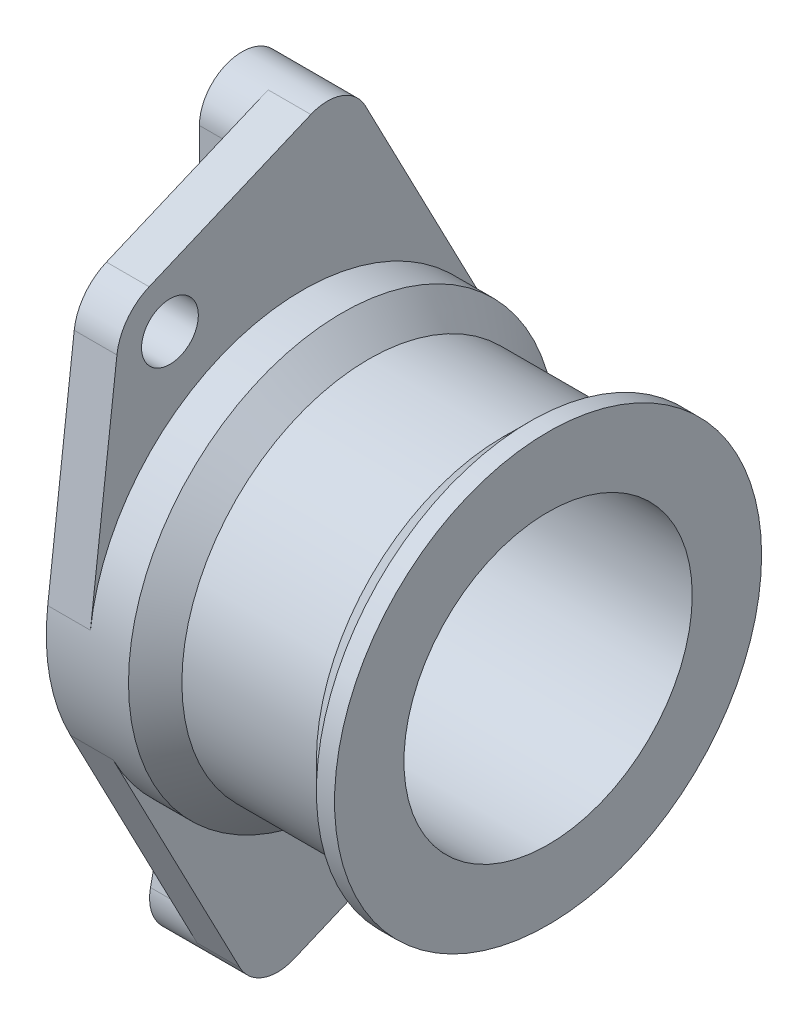
ISO-10303-21;
HEADER;
FILE_DESCRIPTION(('STEP AP214'),'2;1');
FILE_NAME('part.step','',(''),(''),'','','');
FILE_SCHEMA(('AUTOMOTIVE_DESIGN { 1 0 10303 214 1 1 1 1 }'));
ENDSEC;
DATA;
#1=APPLICATION_CONTEXT('core data for automotive mechanical design processes');
#2=APPLICATION_PROTOCOL_DEFINITION('international standard','automotive_design',2000,#1);
#3=PRODUCT_CONTEXT('',#1,'mechanical');
#4=PRODUCT('Part','Part','',(#3));
#5=PRODUCT_RELATED_PRODUCT_CATEGORY('part','',(#4));
#6=PRODUCT_DEFINITION_FORMATION('','',#4);
#7=PRODUCT_DEFINITION_CONTEXT('part definition',#1,'design');
#8=PRODUCT_DEFINITION('design','',#6,#7);
#9=PRODUCT_DEFINITION_SHAPE('','',#8);
#10=(LENGTH_UNIT() NAMED_UNIT(*) SI_UNIT(.MILLI.,.METRE.));
#11=(NAMED_UNIT(*) PLANE_ANGLE_UNIT() SI_UNIT($,.RADIAN.));
#12=(NAMED_UNIT(*) SI_UNIT($,.STERADIAN.) SOLID_ANGLE_UNIT());
#13=UNCERTAINTY_MEASURE_WITH_UNIT(LENGTH_MEASURE(1.E-05),#10,'distance_accuracy_value','');
#14=(GEOMETRIC_REPRESENTATION_CONTEXT(3) GLOBAL_UNCERTAINTY_ASSIGNED_CONTEXT((#13)) GLOBAL_UNIT_ASSIGNED_CONTEXT((#10,
#11,#12)) REPRESENTATION_CONTEXT('',''));
#15=CARTESIAN_POINT('',(0.,0.,0.));
#16=DIRECTION('',(0.,0.,1.));
#17=DIRECTION('',(1.,0.,0.));
#18=AXIS2_PLACEMENT_3D('',#15,#16,#17);
#19=CARTESIAN_POINT('',(0.,-38.3206980670754,2.96616859215302));
#20=DIRECTION('',(1.,0.,0.));
#21=DIRECTION('',(0.,0.,-1.));
#22=AXIS2_PLACEMENT_3D('',#19,#20,#21);
#23=PLANE('',#22);
#24=CARTESIAN_POINT('',(0.,0.,0.));
#25=DIRECTION('',(1.,0.,0.));
#26=DIRECTION('',(0.,0.,-1.));
#27=AXIS2_PLACEMENT_3D('',#24,#25,#26);
#28=CIRCLE('',#27,17.145);
#29=CARTESIAN_POINT('',(0.,0.,-17.145));
#30=VERTEX_POINT('',#29);
#31=EDGE_CURVE('E613',#30,#30,#28,.T.);
#32=ORIENTED_EDGE('',*,*,#31,.T.);
#33=EDGE_LOOP('',(#32));
#34=FACE_BOUND('',#33,.T.);
#35=CARTESIAN_POINT('',(0.,-29.0113860377605,-15.7689530460338));
#36=DIRECTION('',(-1.,0.,0.));
#37=DIRECTION('',(0.,0.,1.));
#38=AXIS2_PLACEMENT_3D('',#35,#36,#37);
#39=CIRCLE('',#38,3.37819999999999);
#40=CARTESIAN_POINT('',(0.,-29.0113860377605,-12.3907530460339));
#41=VERTEX_POINT('',#40);
#42=EDGE_CURVE('E610',#41,#41,#39,.T.);
#43=ORIENTED_EDGE('',*,*,#42,.F.);
#44=EDGE_LOOP('',(#43));
#45=FACE_BOUND('',#44,.T.);
#46=CARTESIAN_POINT('',(0.,29.0113860377605,15.7689530460338));
#47=DIRECTION('',(-1.,0.,0.));
#48=DIRECTION('',(0.,0.,1.));
#49=AXIS2_PLACEMENT_3D('',#46,#47,#48);
#50=CIRCLE('',#49,3.37819999999999);
#51=CARTESIAN_POINT('',(0.,29.0113860377605,19.1471530460338));
#52=VERTEX_POINT('',#51);
#53=EDGE_CURVE('E586',#52,#52,#50,.T.);
#54=ORIENTED_EDGE('',*,*,#53,.F.);
#55=EDGE_LOOP('',(#54));
#56=FACE_BOUND('',#55,.T.);
#57=DIRECTION('',(0.,0.993153514320772,-0.116816509930315));
#58=VECTOR('',#57,1.);
#59=CARTESIAN_POINT('',(0.,33.4227759762591,21.6438522829693));
#60=LINE('',#59,#58);
#61=CARTESIAN_POINT('',(0.,2.96713935223001,25.2260992637476));
#62=VERTEX_POINT('',#61);
#63=CARTESIAN_POINT('',(0.,29.753170875818,22.0754778619707));
#64=VERTEX_POINT('',#63);
#65=EDGE_CURVE('E254',#62,#64,#60,.T.);
#66=ORIENTED_EDGE('',*,*,#65,.T.);
#67=CARTESIAN_POINT('',(0.,29.0113860377605,15.7689530460338));
#68=DIRECTION('',(1.,0.,0.));
#69=DIRECTION('',(0.,0.,-1.));
#70=AXIS2_PLACEMENT_3D('',#67,#68,#69);
#71=CIRCLE('',#70,6.35);
#72=CARTESIAN_POINT('',(0.,34.8607609051211,18.2402510169574));
#73=VERTEX_POINT('',#72);
#74=EDGE_CURVE('E521',#64,#73,#71,.F.);
#75=ORIENTED_EDGE('',*,*,#74,.T.);
#76=DIRECTION('',(0.,0.38918078282261,-0.921161396434729));
#77=VECTOR('',#76,1.);
#78=CARTESIAN_POINT('',(0.,42.9872744688026,-0.994590251859041));
#79=LINE('',#78,#77);
#80=CARTESIAN_POINT('',(0.,42.9872744688025,-0.994590251859041));
#81=VERTEX_POINT('',#80);
#82=EDGE_CURVE('E257',#73,#81,#79,.T.);
#83=ORIENTED_EDGE('',*,*,#82,.T.);
#84=CARTESIAN_POINT('',(0.,38.3206980670754,-2.96616859215302));
#85=DIRECTION('',(-1.,0.,0.));
#86=DIRECTION('',(0.,0.,-1.));
#87=AXIS2_PLACEMENT_3D('',#84,#85,#86);
#88=CIRCLE('',#87,5.065970436656);
#89=CARTESIAN_POINT('',(0.,38.3206980670754,2.09980184450297));
#90=VERTEX_POINT('',#89);
#91=EDGE_CURVE('E582',#90,#81,#88,.T.);
#92=ORIENTED_EDGE('',*,*,#91,.F.);
#93=DIRECTION('',(0.,1.,0.));
#94=VECTOR('',#93,1.);
#95=CARTESIAN_POINT('',(0.,38.3206980670754,2.09980184450297));
#96=LINE('',#95,#94);
#97=CARTESIAN_POINT('',(0.,30.7076011087962,2.09980184450296));
#98=VERTEX_POINT('',#97);
#99=EDGE_CURVE('E202',#98,#90,#96,.T.);
#100=ORIENTED_EDGE('',*,*,#99,.F.);
#101=CARTESIAN_POINT('',(0.,30.7076011087963,-2.16599985834968));
#102=DIRECTION('',(-1.,0.,0.));
#103=DIRECTION('',(0.,0.,-1.));
#104=AXIS2_PLACEMENT_3D('',#101,#102,#103);
#105=CIRCLE('',#104,4.2658017028526);
#106=CARTESIAN_POINT('',(0.,29.8206910640629,-6.33858355920114));
#107=VERTEX_POINT('',#106);
#108=EDGE_CURVE('E592',#107,#98,#105,.T.);
#109=ORIENTED_EDGE('',*,*,#108,.F.);
#110=DIRECTION('',(0.,-0.978147600733805,0.207911690817763));
#111=VECTOR('',#110,1.);
#112=CARTESIAN_POINT('',(0.,29.8206910640629,-6.3385835592011));
#113=LINE('',#112,#111);
#114=CARTESIAN_POINT('',(0.,37.2674235879575,-7.92143542015649));
#115=VERTEX_POINT('',#114);
#116=EDGE_CURVE('E581',#115,#107,#113,.T.);
#117=ORIENTED_EDGE('',*,*,#116,.F.);
#118=CARTESIAN_POINT('',(0.,40.6610705699502,-7.45913120193071));
#119=VERTEX_POINT('',#118);
#120=EDGE_CURVE('E208',#119,#115,#88,.T.);
#121=ORIENTED_EDGE('',*,*,#120,.F.);
#122=DIRECTION('',(0.,-0.886890807192205,-0.461979107880388));
#123=VECTOR('',#122,1.);
#124=CARTESIAN_POINT('',(0.,11.7342693401619,-22.527026502682));
#125=LINE('',#124,#123);
#126=CARTESIAN_POINT('',(0.,11.7342693401619,-22.527026502682));
#127=VERTEX_POINT('',#126);
#128=EDGE_CURVE('E259',#119,#127,#125,.T.);
#129=ORIENTED_EDGE('',*,*,#128,.T.);
#130=CARTESIAN_POINT('',(0.,0.,0.));
#131=DIRECTION('',(-1.,0.,0.));
#132=DIRECTION('',(0.,0.,-1.));
#133=AXIS2_PLACEMENT_3D('',#130,#131,#132);
#134=CIRCLE('',#133,25.4);
#135=CARTESIAN_POINT('',(0.,-2.96713935223,-25.2260992637476));
#136=VERTEX_POINT('',#135);
#137=EDGE_CURVE('E261',#127,#136,#134,.T.);
#138=ORIENTED_EDGE('',*,*,#137,.T.);
#139=DIRECTION('',(0.,-0.993153514320772,0.116816509930315));
#140=VECTOR('',#139,1.);
#141=CARTESIAN_POINT('',(0.,-33.4227759762591,-21.6438522829693));
#142=LINE('',#141,#140);
#143=CARTESIAN_POINT('',(0.,-29.753170875818,-22.0754778619707));
#144=VERTEX_POINT('',#143);
#145=EDGE_CURVE('E263',#136,#144,#142,.T.);
#146=ORIENTED_EDGE('',*,*,#145,.T.);
#147=CARTESIAN_POINT('',(0.,-29.0113860377605,-15.7689530460338));
#148=DIRECTION('',(1.,0.,0.));
#149=DIRECTION('',(0.,0.,-1.));
#150=AXIS2_PLACEMENT_3D('',#147,#148,#149);
#151=CIRCLE('',#150,6.35);
#152=CARTESIAN_POINT('',(0.,-34.8607609051211,-18.2402510169574));
#153=VERTEX_POINT('',#152);
#154=EDGE_CURVE('E519',#144,#153,#151,.F.);
#155=ORIENTED_EDGE('',*,*,#154,.T.);
#156=DIRECTION('',(0.,-0.38918078282261,0.921161396434729));
#157=VECTOR('',#156,1.);
#158=CARTESIAN_POINT('',(0.,-42.9872744688026,0.994590251859035));
#159=LINE('',#158,#157);
#160=CARTESIAN_POINT('',(0.,-42.9872744688026,0.994590251859035));
#161=VERTEX_POINT('',#160);
#162=EDGE_CURVE('E266',#153,#161,#159,.T.);
#163=ORIENTED_EDGE('',*,*,#162,.T.);
#164=CARTESIAN_POINT('',(0.,-38.3206980670754,2.96616859215302));
#165=DIRECTION('',(-1.,0.,0.));
#166=DIRECTION('',(0.,0.,-1.));
#167=AXIS2_PLACEMENT_3D('',#164,#165,#166);
#168=CIRCLE('',#167,5.065970436656);
#169=CARTESIAN_POINT('',(0.,-38.3206980670754,-2.09980184450297));
#170=VERTEX_POINT('',#169);
#171=EDGE_CURVE('E209',#170,#161,#168,.T.);
#172=ORIENTED_EDGE('',*,*,#171,.F.);
#173=DIRECTION('',(0.,-1.,0.));
#174=VECTOR('',#173,1.);
#175=CARTESIAN_POINT('',(0.,-38.3206980670754,-2.09980184450297));
#176=LINE('',#175,#174);
#177=CARTESIAN_POINT('',(0.,-30.7076011087963,-2.09980184450293));
#178=VERTEX_POINT('',#177);
#179=EDGE_CURVE('E223',#178,#170,#176,.T.);
#180=ORIENTED_EDGE('',*,*,#179,.F.);
#181=CARTESIAN_POINT('',(0.,-30.7076011087963,2.16599985834967));
#182=DIRECTION('',(-1.,0.,0.));
#183=DIRECTION('',(0.,0.,-1.));
#184=AXIS2_PLACEMENT_3D('',#181,#182,#183);
#185=CIRCLE('',#184,4.26580170285261);
#186=CARTESIAN_POINT('',(0.,-29.8206910640629,6.3385835592011));
#187=VERTEX_POINT('',#186);
#188=EDGE_CURVE('E232',#187,#178,#185,.T.);
#189=ORIENTED_EDGE('',*,*,#188,.F.);
#190=DIRECTION('',(0.,0.978147600733805,-0.207911690817761));
#191=VECTOR('',#190,1.);
#192=CARTESIAN_POINT('',(0.,-29.8206910640629,6.3385835592011));
#193=LINE('',#192,#191);
#194=CARTESIAN_POINT('',(0.,-37.2674235879575,7.92143542015648));
#195=VERTEX_POINT('',#194);
#196=EDGE_CURVE('E212',#195,#187,#193,.T.);
#197=ORIENTED_EDGE('',*,*,#196,.F.);
#198=CARTESIAN_POINT('',(0.,-40.6610705699502,7.45913120193071));
#199=VERTEX_POINT('',#198);
#200=EDGE_CURVE('E214',#199,#195,#168,.T.);
#201=ORIENTED_EDGE('',*,*,#200,.F.);
#202=DIRECTION('',(0.,0.886890807192205,0.461979107880389));
#203=VECTOR('',#202,1.);
#204=CARTESIAN_POINT('',(0.,-11.7342693401619,22.527026502682));
#205=LINE('',#204,#203);
#206=CARTESIAN_POINT('',(0.,-11.7342693401619,22.527026502682));
#207=VERTEX_POINT('',#206);
#208=EDGE_CURVE('E249',#199,#207,#205,.T.);
#209=ORIENTED_EDGE('',*,*,#208,.T.);
#210=CARTESIAN_POINT('',(0.,0.,0.));
#211=DIRECTION('',(-1.,0.,0.));
#212=DIRECTION('',(0.,0.,-1.));
#213=AXIS2_PLACEMENT_3D('',#210,#211,#212);
#214=CIRCLE('',#213,25.4);
#215=EDGE_CURVE('E251',#207,#62,#214,.T.);
#216=ORIENTED_EDGE('',*,*,#215,.T.);
#217=EDGE_LOOP('',(#66,#75,#83,#92,#100,#109,#117,#121,#129,#138,#146,#155,#163,#172,#180,#189,
#197,#201,#209,#216));
#218=FACE_BOUND('',#217,.T.);
#219=ADVANCED_FACE('F46',(#34,#45,#56,#218),#23,.F.);
#220=CARTESIAN_POINT('',(32.13,0.,0.));
#221=DIRECTION('',(1.,0.,0.));
#222=DIRECTION('',(0.,0.,-1.));
#223=AXIS2_PLACEMENT_3D('',#220,#221,#222);
#224=CONICAL_SURFACE('',#223,25.4,0.785398163397448);
#225=CARTESIAN_POINT('',(28.955,0.,0.));
#226=DIRECTION('',(-1.,0.,0.));
#227=DIRECTION('',(0.,0.,1.));
#228=AXIS2_PLACEMENT_3D('',#225,#226,#227);
#229=CIRCLE('',#228,22.225);
#230=CARTESIAN_POINT('',(28.955,0.,22.225));
#231=VERTEX_POINT('',#230);
#232=EDGE_CURVE('E329',#231,#231,#229,.T.);
#233=ORIENTED_EDGE('',*,*,#232,.F.);
#234=EDGE_LOOP('',(#233));
#235=FACE_BOUND('',#234,.T.);
#236=CARTESIAN_POINT('',(32.13,0.,0.));
#237=DIRECTION('',(1.,0.,0.));
#238=DIRECTION('',(0.,0.,-1.));
#239=AXIS2_PLACEMENT_3D('',#236,#237,#238);
#240=CIRCLE('',#239,25.4);
#241=CARTESIAN_POINT('',(32.13,0.,-25.4));
#242=VERTEX_POINT('',#241);
#243=EDGE_CURVE('E313',#242,#242,#240,.T.);
#244=ORIENTED_EDGE('',*,*,#243,.F.);
#245=EDGE_LOOP('',(#244));
#246=FACE_BOUND('',#245,.T.);
#247=ADVANCED_FACE('F636',(#235,#246),#224,.T.);
#248=CARTESIAN_POINT('',(19.05,0.,0.));
#249=DIRECTION('',(-1.,0.,0.));
#250=DIRECTION('',(0.,0.,1.));
#251=AXIS2_PLACEMENT_3D('',#248,#249,#250);
#252=CYLINDRICAL_SURFACE('',#251,22.225);
#253=CARTESIAN_POINT('',(12.955,0.,0.));
#254=DIRECTION('',(-1.,0.,0.));
#255=DIRECTION('',(0.,0.,1.));
#256=AXIS2_PLACEMENT_3D('',#253,#254,#255);
#257=CIRCLE('',#256,22.225);
#258=CARTESIAN_POINT('',(12.955,0.,22.225));
#259=VERTEX_POINT('',#258);
#260=EDGE_CURVE('E321',#259,#259,#257,.T.);
#261=ORIENTED_EDGE('',*,*,#260,.F.);
#262=EDGE_LOOP('',(#261));
#263=FACE_BOUND('',#262,.T.);
#264=ORIENTED_EDGE('',*,*,#232,.T.);
#265=EDGE_LOOP('',(#264));
#266=FACE_BOUND('',#265,.T.);
#267=ADVANCED_FACE('F638',(#263,#266),#252,.T.);
#268=CARTESIAN_POINT('',(12.955,0.,0.));
#269=DIRECTION('',(-1.,0.,0.));
#270=DIRECTION('',(0.,0.,1.));
#271=AXIS2_PLACEMENT_3D('',#268,#269,#270);
#272=CONICAL_SURFACE('',#271,22.225,0.785398163397448);
#273=CARTESIAN_POINT('',(9.78,0.,0.));
#274=DIRECTION('',(-1.,0.,0.));
#275=DIRECTION('',(0.,0.,1.));
#276=AXIS2_PLACEMENT_3D('',#273,#274,#275);
#277=CIRCLE('',#276,25.4);
#278=CARTESIAN_POINT('',(9.78,0.,25.4));
#279=VERTEX_POINT('',#278);
#280=EDGE_CURVE('E310',#279,#279,#277,.T.);
#281=ORIENTED_EDGE('',*,*,#280,.F.);
#282=EDGE_LOOP('',(#281));
#283=FACE_BOUND('',#282,.T.);
#284=ORIENTED_EDGE('',*,*,#260,.T.);
#285=EDGE_LOOP('',(#284));
#286=FACE_BOUND('',#285,.T.);
#287=ADVANCED_FACE('F632',(#283,#286),#272,.T.);
#288=CARTESIAN_POINT('',(34.29,0.,0.));
#289=DIRECTION('',(-1.,0.,0.));
#290=DIRECTION('',(0.,0.,1.));
#291=AXIS2_PLACEMENT_3D('',#288,#289,#290);
#292=CYLINDRICAL_SURFACE('',#291,25.4);
#293=CARTESIAN_POINT('',(34.29,0.,0.));
#294=DIRECTION('',(1.,0.,0.));
#295=DIRECTION('',(0.,0.,-1.));
#296=AXIS2_PLACEMENT_3D('',#293,#294,#295);
#297=CIRCLE('',#296,25.4);
#298=CARTESIAN_POINT('',(34.29,0.,-25.4));
#299=VERTEX_POINT('',#298);
#300=EDGE_CURVE('E318',#299,#299,#297,.T.);
#301=ORIENTED_EDGE('',*,*,#300,.F.);
#302=EDGE_LOOP('',(#301));
#303=FACE_BOUND('',#302,.T.);
#304=ORIENTED_EDGE('',*,*,#243,.T.);
#305=EDGE_LOOP('',(#304));
#306=FACE_BOUND('',#305,.T.);
#307=ADVANCED_FACE('F626',(#303,#306),#292,.T.);
#308=CARTESIAN_POINT('',(34.29,0.,0.));
#309=DIRECTION('',(1.,0.,0.));
#310=DIRECTION('',(0.,0.,-1.));
#311=AXIS2_PLACEMENT_3D('',#308,#309,#310);
#312=PLANE('',#311);
#313=CARTESIAN_POINT('',(34.29,0.,0.));
#314=DIRECTION('',(1.,0.,0.));
#315=DIRECTION('',(0.,0.,-1.));
#316=AXIS2_PLACEMENT_3D('',#313,#314,#315);
#317=CIRCLE('',#316,17.145);
#318=CARTESIAN_POINT('',(34.29,0.,-17.145));
#319=VERTEX_POINT('',#318);
#320=EDGE_CURVE('E616',#319,#319,#317,.T.);
#321=ORIENTED_EDGE('',*,*,#320,.F.);
#322=EDGE_LOOP('',(#321));
#323=FACE_BOUND('',#322,.T.);
#324=ORIENTED_EDGE('',*,*,#300,.T.);
#325=EDGE_LOOP('',(#324));
#326=FACE_BOUND('',#325,.T.);
#327=ADVANCED_FACE('F623',(#323,#326),#312,.T.);
#328=CARTESIAN_POINT('',(5.08,0.,0.));
#329=DIRECTION('',(1.,0.,0.));
#330=DIRECTION('',(0.,0.,-1.));
#331=AXIS2_PLACEMENT_3D('',#328,#329,#330);
#332=CYLINDRICAL_SURFACE('',#331,25.4);
#333=CARTESIAN_POINT('',(5.08,0.,0.));
#334=DIRECTION('',(-1.,0.,0.));
#335=DIRECTION('',(0.,0.,1.));
#336=AXIS2_PLACEMENT_3D('',#333,#334,#335);
#337=CIRCLE('',#336,25.4);
#338=CARTESIAN_POINT('',(5.08,2.96713935223001,25.2260992637476));
#339=VERTEX_POINT('',#338);
#340=CARTESIAN_POINT('',(5.08,11.7342693401619,-22.527026502682));
#341=VERTEX_POINT('',#340);
#342=EDGE_CURVE('E311',#339,#341,#337,.T.);
#343=ORIENTED_EDGE('',*,*,#342,.F.);
#344=DIRECTION('',(1.,0.,0.));
#345=VECTOR('',#344,1.);
#346=CARTESIAN_POINT('',(0.,2.96713935223001,25.2260992637476));
#347=LINE('',#346,#345);
#348=EDGE_CURVE('E301',#62,#339,#347,.T.);
#349=ORIENTED_EDGE('',*,*,#348,.F.);
#350=ORIENTED_EDGE('',*,*,#215,.F.);
#351=DIRECTION('',(1.,0.,0.));
#352=VECTOR('',#351,1.);
#353=CARTESIAN_POINT('',(0.,-11.7342693401619,22.527026502682));
#354=LINE('',#353,#352);
#355=CARTESIAN_POINT('',(5.08,-11.7342693401619,22.527026502682));
#356=VERTEX_POINT('',#355);
#357=EDGE_CURVE('E304',#207,#356,#354,.T.);
#358=ORIENTED_EDGE('',*,*,#357,.T.);
#359=CARTESIAN_POINT('',(5.08,-2.96713935223001,-25.2260992637476));
#360=VERTEX_POINT('',#359);
#361=EDGE_CURVE('E314',#360,#356,#337,.T.);
#362=ORIENTED_EDGE('',*,*,#361,.F.);
#363=DIRECTION('',(1.,0.,0.));
#364=VECTOR('',#363,1.);
#365=CARTESIAN_POINT('',(0.,-2.96713935223,-25.2260992637476));
#366=LINE('',#365,#364);
#367=EDGE_CURVE('E289',#136,#360,#366,.T.);
#368=ORIENTED_EDGE('',*,*,#367,.F.);
#369=ORIENTED_EDGE('',*,*,#137,.F.);
#370=DIRECTION('',(1.,0.,0.));
#371=VECTOR('',#370,1.);
#372=CARTESIAN_POINT('',(0.,11.7342693401619,-22.527026502682));
#373=LINE('',#372,#371);
#374=EDGE_CURVE('E292',#127,#341,#373,.T.);
#375=ORIENTED_EDGE('',*,*,#374,.T.);
#376=EDGE_LOOP('',(#343,#349,#350,#358,#362,#368,#369,#375));
#377=FACE_BOUND('',#376,.T.);
#378=ORIENTED_EDGE('',*,*,#280,.T.);
#379=EDGE_LOOP('',(#378));
#380=FACE_BOUND('',#379,.T.);
#381=ADVANCED_FACE('F556',(#377,#380),#332,.T.);
#382=CARTESIAN_POINT('',(5.08,-38.3206980670754,2.96616859215302));
#383=DIRECTION('',(1.,0.,0.));
#384=DIRECTION('',(0.,0.,-1.));
#385=AXIS2_PLACEMENT_3D('',#382,#383,#384);
#386=PLANE('',#385);
#387=CARTESIAN_POINT('',(5.08,29.0113860377605,15.7689530460338));
#388=DIRECTION('',(1.,0.,0.));
#389=DIRECTION('',(0.,0.,-1.));
#390=AXIS2_PLACEMENT_3D('',#387,#388,#389);
#391=CIRCLE('',#390,3.37819999999999);
#392=CARTESIAN_POINT('',(5.08,29.0113860377605,12.3907530460339));
#393=VERTEX_POINT('',#392);
#394=EDGE_CURVE('E583',#393,#393,#391,.T.);
#395=ORIENTED_EDGE('',*,*,#394,.F.);
#396=EDGE_LOOP('',(#395));
#397=FACE_BOUND('',#396,.T.);
#398=DIRECTION('',(0.,0.38918078282261,-0.921161396434729));
#399=VECTOR('',#398,1.);
#400=CARTESIAN_POINT('',(5.08,42.9872744688026,-0.994590251859041));
#401=LINE('',#400,#399);
#402=CARTESIAN_POINT('',(5.08,34.8607609051211,18.2402510169574));
#403=VERTEX_POINT('',#402);
#404=CARTESIAN_POINT('',(5.08,42.9872744688025,-0.994590251859041));
#405=VERTEX_POINT('',#404);
#406=EDGE_CURVE('E277',#403,#405,#401,.T.);
#407=ORIENTED_EDGE('',*,*,#406,.F.);
#408=CARTESIAN_POINT('',(5.08,29.0113860377605,15.7689530460338));
#409=DIRECTION('',(1.,0.,0.));
#410=DIRECTION('',(0.,0.,-1.));
#411=AXIS2_PLACEMENT_3D('',#408,#409,#410);
#412=CIRCLE('',#411,6.35);
#413=CARTESIAN_POINT('',(5.08,29.753170875818,22.0754778619707));
#414=VERTEX_POINT('',#413);
#415=EDGE_CURVE('E515',#403,#414,#412,.T.);
#416=ORIENTED_EDGE('',*,*,#415,.T.);
#417=DIRECTION('',(0.,0.993153514320772,-0.116816509930315));
#418=VECTOR('',#417,1.);
#419=CARTESIAN_POINT('',(5.08,33.4227759762591,21.6438522829693));
#420=LINE('',#419,#418);
#421=EDGE_CURVE('E274',#339,#414,#420,.T.);
#422=ORIENTED_EDGE('',*,*,#421,.F.);
#423=ORIENTED_EDGE('',*,*,#342,.T.);
#424=DIRECTION('',(0.,-0.886890807192205,-0.461979107880388));
#425=VECTOR('',#424,1.);
#426=CARTESIAN_POINT('',(5.08,11.7342693401619,-22.527026502682));
#427=LINE('',#426,#425);
#428=CARTESIAN_POINT('',(5.08,40.6610705699502,-7.45913120193072));
#429=VERTEX_POINT('',#428);
#430=EDGE_CURVE('E281',#429,#341,#427,.T.);
#431=ORIENTED_EDGE('',*,*,#430,.F.);
#432=CARTESIAN_POINT('',(5.08,38.3206980670754,-2.96616859215302));
#433=DIRECTION('',(-1.,0.,0.));
#434=DIRECTION('',(0.,0.,-1.));
#435=AXIS2_PLACEMENT_3D('',#432,#433,#434);
#436=CIRCLE('',#435,5.065970436656);
#437=EDGE_CURVE('E279',#405,#429,#436,.T.);
#438=ORIENTED_EDGE('',*,*,#437,.F.);
#439=EDGE_LOOP('',(#407,#416,#422,#423,#431,#438));
#440=FACE_BOUND('',#439,.T.);
#441=ADVANCED_FACE('F572',(#397,#440),#386,.T.);
#442=CARTESIAN_POINT('',(0.,-38.3206980670754,2.96616859215302));
#443=DIRECTION('',(1.,0.,0.));
#444=DIRECTION('',(0.,0.,-1.));
#445=AXIS2_PLACEMENT_3D('',#442,#443,#444);
#446=CYLINDRICAL_SURFACE('',#445,5.065970436656);
#447=CARTESIAN_POINT('',(5.08,-38.3206980670754,2.96616859215302));
#448=DIRECTION('',(-1.,0.,0.));
#449=DIRECTION('',(0.,0.,-1.));
#450=AXIS2_PLACEMENT_3D('',#447,#448,#449);
#451=CIRCLE('',#450,5.065970436656);
#452=CARTESIAN_POINT('',(5.08,-42.9872744688026,0.994590251859035));
#453=VERTEX_POINT('',#452);
#454=CARTESIAN_POINT('',(5.08,-40.6610705699502,7.45913120193071));
#455=VERTEX_POINT('',#454);
#456=EDGE_CURVE('E248',#453,#455,#451,.T.);
#457=ORIENTED_EDGE('',*,*,#456,.T.);
#458=DIRECTION('',(1.,0.,0.));
#459=VECTOR('',#458,1.);
#460=CARTESIAN_POINT('',(0.,-40.6610705699502,7.45913120193071));
#461=LINE('',#460,#459);
#462=EDGE_CURVE('E307',#199,#455,#461,.T.);
#463=ORIENTED_EDGE('',*,*,#462,.F.);
#464=ORIENTED_EDGE('',*,*,#200,.T.);
#465=DIRECTION('',(1.,0.,0.));
#466=VECTOR('',#465,1.);
#467=CARTESIAN_POINT('',(-5.08,-37.2674235879575,7.92143542015648));
#468=LINE('',#467,#466);
#469=CARTESIAN_POINT('',(-5.08,-37.2674235879575,7.92143542015648));
#470=VERTEX_POINT('',#469);
#471=EDGE_CURVE('E245',#470,#195,#468,.T.);
#472=ORIENTED_EDGE('',*,*,#471,.F.);
#473=CARTESIAN_POINT('',(-5.08,-38.3206980670754,2.96616859215302));
#474=DIRECTION('',(-1.,0.,0.));
#475=DIRECTION('',(0.,0.,-1.));
#476=AXIS2_PLACEMENT_3D('',#473,#474,#475);
#477=CIRCLE('',#476,5.065970436656);
#478=CARTESIAN_POINT('',(-5.08,-38.3206980670754,-2.09980184450297));
#479=VERTEX_POINT('',#478);
#480=EDGE_CURVE('E219',#479,#470,#477,.T.);
#481=ORIENTED_EDGE('',*,*,#480,.F.);
#482=DIRECTION('',(1.,0.,0.));
#483=VECTOR('',#482,1.);
#484=CARTESIAN_POINT('',(-5.08,-38.3206980670754,-2.09980184450297));
#485=LINE('',#484,#483);
#486=EDGE_CURVE('E228',#479,#170,#485,.T.);
#487=ORIENTED_EDGE('',*,*,#486,.T.);
#488=ORIENTED_EDGE('',*,*,#171,.T.);
#489=DIRECTION('',(1.,0.,0.));
#490=VECTOR('',#489,1.);
#491=CARTESIAN_POINT('',(0.,-42.9872744688026,0.994590251859035));
#492=LINE('',#491,#490);
#493=EDGE_CURVE('E268',#161,#453,#492,.T.);
#494=ORIENTED_EDGE('',*,*,#493,.T.);
#495=EDGE_LOOP('',(#457,#463,#464,#472,#481,#487,#488,#494));
#496=FACE_BOUND('',#495,.T.);
#497=ADVANCED_FACE('F533',(#496),#446,.T.);
#498=CARTESIAN_POINT('',(0.,-11.7342693401619,22.527026502682));
#499=DIRECTION('',(0.,0.461979107880389,-0.886890807192205));
#500=DIRECTION('',(0.,0.886890807192205,0.461979107880389));
#501=AXIS2_PLACEMENT_3D('',#498,#499,#500);
#502=PLANE('',#501);
#503=DIRECTION('',(0.,0.886890807192205,0.461979107880389));
#504=VECTOR('',#503,1.);
#505=CARTESIAN_POINT('',(5.08,-11.7342693401619,22.527026502682));
#506=LINE('',#505,#504);
#507=EDGE_CURVE('E271',#455,#356,#506,.T.);
#508=ORIENTED_EDGE('',*,*,#507,.T.);
#509=ORIENTED_EDGE('',*,*,#357,.F.);
#510=ORIENTED_EDGE('',*,*,#208,.F.);
#511=ORIENTED_EDGE('',*,*,#462,.T.);
#512=EDGE_LOOP('',(#508,#509,#510,#511));
#513=FACE_BOUND('',#512,.T.);
#514=ADVANCED_FACE('F552',(#513),#502,.F.);
#515=CARTESIAN_POINT('',(0.,33.4227759762591,21.6438522829693));
#516=DIRECTION('',(0.,-0.116816509930316,-0.993153514320772));
#517=DIRECTION('',(0.,0.993153514320772,-0.116816509930316));
#518=AXIS2_PLACEMENT_3D('',#515,#516,#517);
#519=PLANE('',#518);
#520=ORIENTED_EDGE('',*,*,#421,.T.);
#521=DIRECTION('',(1.,0.,0.));
#522=VECTOR('',#521,1.);
#523=CARTESIAN_POINT('',(0.,29.753170875818,22.0754778619707));
#524=LINE('',#523,#522);
#525=EDGE_CURVE('E517',#414,#64,#524,.F.);
#526=ORIENTED_EDGE('',*,*,#525,.T.);
#527=ORIENTED_EDGE('',*,*,#65,.F.);
#528=ORIENTED_EDGE('',*,*,#348,.T.);
#529=EDGE_LOOP('',(#520,#526,#527,#528));
#530=FACE_BOUND('',#529,.T.);
#531=ADVANCED_FACE('F702',(#530),#519,.F.);
#532=CARTESIAN_POINT('',(0.,42.9872744688026,-0.994590251859041));
#533=DIRECTION('',(0.,-0.921161396434729,-0.38918078282261));
#534=DIRECTION('',(0.,0.38918078282261,-0.921161396434729));
#535=AXIS2_PLACEMENT_3D('',#532,#533,#534);
#536=PLANE('',#535);
#537=ORIENTED_EDGE('',*,*,#82,.F.);
#538=DIRECTION('',(1.,0.,0.));
#539=VECTOR('',#538,1.);
#540=CARTESIAN_POINT('',(0.,34.8607609051211,18.2402510169574));
#541=LINE('',#540,#539);
#542=EDGE_CURVE('E509',#73,#403,#541,.T.);
#543=ORIENTED_EDGE('',*,*,#542,.T.);
#544=ORIENTED_EDGE('',*,*,#406,.T.);
#545=DIRECTION('',(1.,0.,0.));
#546=VECTOR('',#545,1.);
#547=CARTESIAN_POINT('',(0.,42.9872744688025,-0.994590251859041));
#548=LINE('',#547,#546);
#549=EDGE_CURVE('E298',#81,#405,#548,.T.);
#550=ORIENTED_EDGE('',*,*,#549,.F.);
#551=EDGE_LOOP('',(#537,#543,#544,#550));
#552=FACE_BOUND('',#551,.T.);
#553=ADVANCED_FACE('F568',(#552),#536,.F.);
#554=CARTESIAN_POINT('',(0.,38.3206980670754,-2.96616859215302));
#555=DIRECTION('',(1.,0.,0.));
#556=DIRECTION('',(0.,0.,-1.));
#557=AXIS2_PLACEMENT_3D('',#554,#555,#556);
#558=CYLINDRICAL_SURFACE('',#557,5.065970436656);
#559=ORIENTED_EDGE('',*,*,#437,.T.);
#560=DIRECTION('',(1.,0.,0.));
#561=VECTOR('',#560,1.);
#562=CARTESIAN_POINT('',(0.,40.6610705699502,-7.45913120193072));
#563=LINE('',#562,#561);
#564=EDGE_CURVE('E295',#119,#429,#563,.T.);
#565=ORIENTED_EDGE('',*,*,#564,.F.);
#566=ORIENTED_EDGE('',*,*,#120,.T.);
#567=DIRECTION('',(1.,0.,0.));
#568=VECTOR('',#567,1.);
#569=CARTESIAN_POINT('',(-5.08,37.2674235879575,-7.92143542015649));
#570=LINE('',#569,#568);
#571=CARTESIAN_POINT('',(-5.08,37.2674235879575,-7.92143542015649));
#572=VERTEX_POINT('',#571);
#573=EDGE_CURVE('E187',#572,#115,#570,.T.);
#574=ORIENTED_EDGE('',*,*,#573,.F.);
#575=CARTESIAN_POINT('',(-5.08,38.3206980670754,-2.96616859215302));
#576=DIRECTION('',(-1.,0.,0.));
#577=DIRECTION('',(0.,0.,-1.));
#578=AXIS2_PLACEMENT_3D('',#575,#576,#577);
#579=CIRCLE('',#578,5.065970436656);
#580=CARTESIAN_POINT('',(-5.08,38.3206980670754,2.09980184450297));
#581=VERTEX_POINT('',#580);
#582=EDGE_CURVE('E193',#581,#572,#579,.T.);
#583=ORIENTED_EDGE('',*,*,#582,.F.);
#584=DIRECTION('',(1.,0.,0.));
#585=VECTOR('',#584,1.);
#586=CARTESIAN_POINT('',(-5.08,38.3206980670754,2.09980184450297));
#587=LINE('',#586,#585);
#588=EDGE_CURVE('E597',#581,#90,#587,.T.);
#589=ORIENTED_EDGE('',*,*,#588,.T.);
#590=ORIENTED_EDGE('',*,*,#91,.T.);
#591=ORIENTED_EDGE('',*,*,#549,.T.);
#592=EDGE_LOOP('',(#559,#565,#566,#574,#583,#589,#590,#591));
#593=FACE_BOUND('',#592,.T.);
#594=ADVANCED_FACE('F205',(#593),#558,.T.);
#595=CARTESIAN_POINT('',(0.,11.7342693401619,-22.527026502682));
#596=DIRECTION('',(0.,-0.461979107880388,0.886890807192205));
#597=DIRECTION('',(0.,-0.886890807192205,-0.461979107880388));
#598=AXIS2_PLACEMENT_3D('',#595,#596,#597);
#599=PLANE('',#598);
#600=ORIENTED_EDGE('',*,*,#430,.T.);
#601=ORIENTED_EDGE('',*,*,#374,.F.);
#602=ORIENTED_EDGE('',*,*,#128,.F.);
#603=ORIENTED_EDGE('',*,*,#564,.T.);
#604=EDGE_LOOP('',(#600,#601,#602,#603));
#605=FACE_BOUND('',#604,.T.);
#606=ADVANCED_FACE('F577',(#605),#599,.F.);
#607=CARTESIAN_POINT('',(0.,-33.4227759762591,-21.6438522829693));
#608=DIRECTION('',(0.,0.116816509930315,0.993153514320772));
#609=DIRECTION('',(0.,-0.993153514320772,0.116816509930315));
#610=AXIS2_PLACEMENT_3D('',#607,#608,#609);
#611=PLANE('',#610);
#612=DIRECTION('',(0.,-0.993153514320772,0.116816509930315));
#613=VECTOR('',#612,1.);
#614=CARTESIAN_POINT('',(5.08,-33.4227759762591,-21.6438522829693));
#615=LINE('',#614,#613);
#616=CARTESIAN_POINT('',(5.08,-29.753170875818,-22.0754778619707));
#617=VERTEX_POINT('',#616);
#618=EDGE_CURVE('E284',#360,#617,#615,.T.);
#619=ORIENTED_EDGE('',*,*,#618,.T.);
#620=DIRECTION('',(1.,0.,0.));
#621=VECTOR('',#620,1.);
#622=CARTESIAN_POINT('',(0.,-29.753170875818,-22.0754778619707));
#623=LINE('',#622,#621);
#624=EDGE_CURVE('E12',#617,#144,#623,.F.);
#625=ORIENTED_EDGE('',*,*,#624,.T.);
#626=ORIENTED_EDGE('',*,*,#145,.F.);
#627=ORIENTED_EDGE('',*,*,#367,.T.);
#628=EDGE_LOOP('',(#619,#625,#626,#627));
#629=FACE_BOUND('',#628,.T.);
#630=ADVANCED_FACE('F692',(#629),#611,.F.);
#631=CARTESIAN_POINT('',(0.,-42.9872744688026,0.994590251859035));
#632=DIRECTION('',(0.,0.921161396434729,0.38918078282261));
#633=DIRECTION('',(0.,-0.38918078282261,0.921161396434729));
#634=AXIS2_PLACEMENT_3D('',#631,#632,#633);
#635=PLANE('',#634);
#636=ORIENTED_EDGE('',*,*,#162,.F.);
#637=DIRECTION('',(1.,0.,0.));
#638=VECTOR('',#637,1.);
#639=CARTESIAN_POINT('',(0.,-34.8607609051211,-18.2402510169574));
#640=LINE('',#639,#638);
#641=CARTESIAN_POINT('',(5.08,-34.8607609051211,-18.2402510169574));
#642=VERTEX_POINT('',#641);
#643=EDGE_CURVE('E523',#153,#642,#640,.T.);
#644=ORIENTED_EDGE('',*,*,#643,.T.);
#645=DIRECTION('',(0.,-0.38918078282261,0.921161396434729));
#646=VECTOR('',#645,1.);
#647=CARTESIAN_POINT('',(5.08,-42.9872744688026,0.994590251859035));
#648=LINE('',#647,#646);
#649=EDGE_CURVE('E252',#642,#453,#648,.T.);
#650=ORIENTED_EDGE('',*,*,#649,.T.);
#651=ORIENTED_EDGE('',*,*,#493,.F.);
#652=EDGE_LOOP('',(#636,#644,#650,#651));
#653=FACE_BOUND('',#652,.T.);
#654=ADVANCED_FACE('F526',(#653),#635,.F.);
#655=CARTESIAN_POINT('',(5.08,-29.0113860377605,-15.7689530460338));
#656=DIRECTION('',(1.,0.,0.));
#657=DIRECTION('',(0.,0.,-1.));
#658=AXIS2_PLACEMENT_3D('',#655,#656,#657);
#659=CIRCLE('',#658,3.37819999999999);
#660=CARTESIAN_POINT('',(5.08,-29.0113860377605,-19.1471530460338));
#661=VERTEX_POINT('',#660);
#662=EDGE_CURVE('E607',#661,#661,#659,.T.);
#663=ORIENTED_EDGE('',*,*,#662,.F.);
#664=EDGE_LOOP('',(#663));
#665=FACE_BOUND('',#664,.T.);
#666=ORIENTED_EDGE('',*,*,#649,.F.);
#667=CARTESIAN_POINT('',(5.08,-29.0113860377605,-15.7689530460338));
#668=DIRECTION('',(1.,0.,0.));
#669=DIRECTION('',(0.,0.,-1.));
#670=AXIS2_PLACEMENT_3D('',#667,#668,#669);
#671=CIRCLE('',#670,6.35);
#672=EDGE_CURVE('E54',#642,#617,#671,.T.);
#673=ORIENTED_EDGE('',*,*,#672,.T.);
#674=ORIENTED_EDGE('',*,*,#618,.F.);
#675=ORIENTED_EDGE('',*,*,#361,.T.);
#676=ORIENTED_EDGE('',*,*,#507,.F.);
#677=ORIENTED_EDGE('',*,*,#456,.F.);
#678=EDGE_LOOP('',(#666,#673,#674,#675,#676,#677));
#679=FACE_BOUND('',#678,.T.);
#680=ADVANCED_FACE('F530',(#665,#679),#386,.T.);
#681=CARTESIAN_POINT('',(-5.08,-29.8206910640629,6.3385835592011));
#682=DIRECTION('',(0.,-0.207911690817761,-0.978147600733805));
#683=DIRECTION('',(0.,0.978147600733805,-0.207911690817762));
#684=AXIS2_PLACEMENT_3D('',#681,#682,#683);
#685=PLANE('',#684);
#686=ORIENTED_EDGE('',*,*,#196,.T.);
#687=DIRECTION('',(1.,0.,0.));
#688=VECTOR('',#687,1.);
#689=CARTESIAN_POINT('',(-5.08,-29.8206910640629,6.3385835592011));
#690=LINE('',#689,#688);
#691=CARTESIAN_POINT('',(-5.08,-29.8206910640629,6.3385835592011));
#692=VERTEX_POINT('',#691);
#693=EDGE_CURVE('E242',#692,#187,#690,.T.);
#694=ORIENTED_EDGE('',*,*,#693,.F.);
#695=DIRECTION('',(0.,0.978147600733805,-0.207911690817761));
#696=VECTOR('',#695,1.);
#697=CARTESIAN_POINT('',(-5.08,-29.8206910640629,6.3385835592011));
#698=LINE('',#697,#696);
#699=EDGE_CURVE('E222',#470,#692,#698,.T.);
#700=ORIENTED_EDGE('',*,*,#699,.F.);
#701=ORIENTED_EDGE('',*,*,#471,.T.);
#702=EDGE_LOOP('',(#686,#694,#700,#701));
#703=FACE_BOUND('',#702,.T.);
#704=ADVANCED_FACE('F547',(#703),#685,.F.);
#705=CARTESIAN_POINT('',(-5.08,-30.7076011087963,2.16599985834967));
#706=DIRECTION('',(1.,0.,0.));
#707=DIRECTION('',(0.,0.,-1.));
#708=AXIS2_PLACEMENT_3D('',#705,#706,#707);
#709=CYLINDRICAL_SURFACE('',#708,4.26580170285261);
#710=ORIENTED_EDGE('',*,*,#188,.T.);
#711=DIRECTION('',(1.,0.,0.));
#712=VECTOR('',#711,1.);
#713=CARTESIAN_POINT('',(-5.08,-30.7076011087963,-2.09980184450293));
#714=LINE('',#713,#712);
#715=CARTESIAN_POINT('',(-5.08,-30.7076011087963,-2.09980184450293));
#716=VERTEX_POINT('',#715);
#717=EDGE_CURVE('E239',#716,#178,#714,.T.);
#718=ORIENTED_EDGE('',*,*,#717,.F.);
#719=CARTESIAN_POINT('',(-5.08,-30.7076011087963,2.16599985834967));
#720=DIRECTION('',(-1.,0.,0.));
#721=DIRECTION('',(0.,0.,-1.));
#722=AXIS2_PLACEMENT_3D('',#719,#720,#721);
#723=CIRCLE('',#722,4.26580170285261);
#724=EDGE_CURVE('E225',#692,#716,#723,.T.);
#725=ORIENTED_EDGE('',*,*,#724,.F.);
#726=ORIENTED_EDGE('',*,*,#693,.T.);
#727=EDGE_LOOP('',(#710,#718,#725,#726));
#728=FACE_BOUND('',#727,.T.);
#729=ADVANCED_FACE('F544',(#728),#709,.T.);
#730=CARTESIAN_POINT('',(-5.08,-38.3206980670754,-2.09980184450297));
#731=DIRECTION('',(0.,0.,1.));
#732=DIRECTION('',(0.,-1.,0.));
#733=AXIS2_PLACEMENT_3D('',#730,#731,#732);
#734=PLANE('',#733);
#735=ORIENTED_EDGE('',*,*,#179,.T.);
#736=ORIENTED_EDGE('',*,*,#486,.F.);
#737=DIRECTION('',(0.,-1.,0.));
#738=VECTOR('',#737,1.);
#739=CARTESIAN_POINT('',(-5.08,-38.3206980670754,-2.09980184450297));
#740=LINE('',#739,#738);
#741=EDGE_CURVE('E227',#716,#479,#740,.T.);
#742=ORIENTED_EDGE('',*,*,#741,.F.);
#743=ORIENTED_EDGE('',*,*,#717,.T.);
#744=EDGE_LOOP('',(#735,#736,#742,#743));
#745=FACE_BOUND('',#744,.T.);
#746=ADVANCED_FACE('F539',(#745),#734,.F.);
#747=CARTESIAN_POINT('',(-5.08,-38.3206980670754,2.96616859215302));
#748=DIRECTION('',(1.,0.,0.));
#749=DIRECTION('',(0.,0.,-1.));
#750=AXIS2_PLACEMENT_3D('',#747,#748,#749);
#751=PLANE('',#750);
#752=ORIENTED_EDGE('',*,*,#480,.T.);
#753=ORIENTED_EDGE('',*,*,#699,.T.);
#754=ORIENTED_EDGE('',*,*,#724,.T.);
#755=ORIENTED_EDGE('',*,*,#741,.T.);
#756=EDGE_LOOP('',(#752,#753,#754,#755));
#757=FACE_BOUND('',#756,.T.);
#758=ADVANCED_FACE('F677',(#757),#751,.F.);
#759=CARTESIAN_POINT('',(-5.08,29.8206910640629,-6.3385835592011));
#760=DIRECTION('',(0.,0.207911690817763,0.978147600733805));
#761=DIRECTION('',(0.,-0.978147600733805,0.207911690817763));
#762=AXIS2_PLACEMENT_3D('',#759,#760,#761);
#763=PLANE('',#762);
#764=ORIENTED_EDGE('',*,*,#116,.T.);
#765=DIRECTION('',(1.,0.,0.));
#766=VECTOR('',#765,1.);
#767=CARTESIAN_POINT('',(-5.08,29.8206910640629,-6.3385835592011));
#768=LINE('',#767,#766);
#769=CARTESIAN_POINT('',(-5.08,29.8206910640629,-6.3385835592011));
#770=VERTEX_POINT('',#769);
#771=EDGE_CURVE('E189',#770,#107,#768,.T.);
#772=ORIENTED_EDGE('',*,*,#771,.F.);
#773=DIRECTION('',(0.,-0.978147600733805,0.207911690817763));
#774=VECTOR('',#773,1.);
#775=CARTESIAN_POINT('',(-5.08,29.8206910640629,-6.3385835592011));
#776=LINE('',#775,#774);
#777=EDGE_CURVE('E182',#572,#770,#776,.T.);
#778=ORIENTED_EDGE('',*,*,#777,.F.);
#779=ORIENTED_EDGE('',*,*,#573,.T.);
#780=EDGE_LOOP('',(#764,#772,#778,#779));
#781=FACE_BOUND('',#780,.T.);
#782=ADVANCED_FACE('F185',(#781),#763,.F.);
#783=CARTESIAN_POINT('',(-5.08,30.7076011087963,-2.16599985834968));
#784=DIRECTION('',(1.,0.,0.));
#785=DIRECTION('',(0.,0.,-1.));
#786=AXIS2_PLACEMENT_3D('',#783,#784,#785);
#787=CYLINDRICAL_SURFACE('',#786,4.2658017028526);
#788=ORIENTED_EDGE('',*,*,#108,.T.);
#789=DIRECTION('',(1.,0.,0.));
#790=VECTOR('',#789,1.);
#791=CARTESIAN_POINT('',(-5.08,30.7076011087963,2.09980184450292));
#792=LINE('',#791,#790);
#793=CARTESIAN_POINT('',(-5.08,30.7076011087963,2.09980184450292));
#794=VERTEX_POINT('',#793);
#795=EDGE_CURVE('E215',#794,#98,#792,.T.);
#796=ORIENTED_EDGE('',*,*,#795,.F.);
#797=CARTESIAN_POINT('',(-5.08,30.7076011087963,-2.16599985834968));
#798=DIRECTION('',(-1.,0.,0.));
#799=DIRECTION('',(0.,0.,-1.));
#800=AXIS2_PLACEMENT_3D('',#797,#798,#799);
#801=CIRCLE('',#800,4.2658017028526);
#802=EDGE_CURVE('E192',#770,#794,#801,.T.);
#803=ORIENTED_EDGE('',*,*,#802,.F.);
#804=ORIENTED_EDGE('',*,*,#771,.T.);
#805=EDGE_LOOP('',(#788,#796,#803,#804));
#806=FACE_BOUND('',#805,.T.);
#807=ADVANCED_FACE('F603',(#806),#787,.T.);
#808=CARTESIAN_POINT('',(-5.08,38.3206980670754,2.09980184450297));
#809=DIRECTION('',(0.,0.,-1.));
#810=DIRECTION('',(0.,1.,0.));
#811=AXIS2_PLACEMENT_3D('',#808,#809,#810);
#812=PLANE('',#811);
#813=ORIENTED_EDGE('',*,*,#99,.T.);
#814=ORIENTED_EDGE('',*,*,#588,.F.);
#815=DIRECTION('',(0.,1.,0.));
#816=VECTOR('',#815,1.);
#817=CARTESIAN_POINT('',(-5.08,38.3206980670754,2.09980184450297));
#818=LINE('',#817,#816);
#819=EDGE_CURVE('E198',#794,#581,#818,.T.);
#820=ORIENTED_EDGE('',*,*,#819,.F.);
#821=ORIENTED_EDGE('',*,*,#795,.T.);
#822=EDGE_LOOP('',(#813,#814,#820,#821));
#823=FACE_BOUND('',#822,.T.);
#824=ADVANCED_FACE('F601',(#823),#812,.F.);
#825=CARTESIAN_POINT('',(-5.08,38.3206980670754,-2.96616859215302));
#826=DIRECTION('',(1.,0.,0.));
#827=DIRECTION('',(0.,0.,-1.));
#828=AXIS2_PLACEMENT_3D('',#825,#826,#827);
#829=PLANE('',#828);
#830=ORIENTED_EDGE('',*,*,#582,.T.);
#831=ORIENTED_EDGE('',*,*,#777,.T.);
#832=ORIENTED_EDGE('',*,*,#802,.T.);
#833=ORIENTED_EDGE('',*,*,#819,.T.);
#834=EDGE_LOOP('',(#830,#831,#832,#833));
#835=FACE_BOUND('',#834,.T.);
#836=ADVANCED_FACE('F196',(#835),#829,.F.);
#837=CARTESIAN_POINT('',(0.,29.0113860377605,15.7689530460338));
#838=DIRECTION('',(-1.,0.,0.));
#839=DIRECTION('',(0.,0.,1.));
#840=AXIS2_PLACEMENT_3D('',#837,#838,#839);
#841=CYLINDRICAL_SURFACE('',#840,3.37819999999999);
#842=ORIENTED_EDGE('',*,*,#394,.T.);
#843=EDGE_LOOP('',(#842));
#844=FACE_BOUND('',#843,.T.);
#845=ORIENTED_EDGE('',*,*,#53,.T.);
#846=EDGE_LOOP('',(#845));
#847=FACE_BOUND('',#846,.T.);
#848=ADVANCED_FACE('F662',(#844,#847),#841,.F.);
#849=CARTESIAN_POINT('',(0.,-29.0113860377605,-15.7689530460338));
#850=DIRECTION('',(-1.,0.,0.));
#851=DIRECTION('',(0.,0.,1.));
#852=AXIS2_PLACEMENT_3D('',#849,#850,#851);
#853=CYLINDRICAL_SURFACE('',#852,3.37819999999999);
#854=ORIENTED_EDGE('',*,*,#662,.T.);
#855=EDGE_LOOP('',(#854));
#856=FACE_BOUND('',#855,.T.);
#857=ORIENTED_EDGE('',*,*,#42,.T.);
#858=EDGE_LOOP('',(#857));
#859=FACE_BOUND('',#858,.T.);
#860=ADVANCED_FACE('F657',(#856,#859),#853,.F.);
#861=CARTESIAN_POINT('',(34.29,0.,0.));
#862=DIRECTION('',(1.,0.,0.));
#863=DIRECTION('',(0.,0.,-1.));
#864=AXIS2_PLACEMENT_3D('',#861,#862,#863);
#865=CYLINDRICAL_SURFACE('',#864,17.145);
#866=ORIENTED_EDGE('',*,*,#320,.T.);
#867=EDGE_LOOP('',(#866));
#868=FACE_BOUND('',#867,.T.);
#869=ORIENTED_EDGE('',*,*,#31,.F.);
#870=EDGE_LOOP('',(#869));
#871=FACE_BOUND('',#870,.T.);
#872=ADVANCED_FACE('F620',(#868,#871),#865,.F.);
#873=CARTESIAN_POINT('',(0.,29.0113860377605,15.7689530460338));
#874=DIRECTION('',(1.,0.,0.));
#875=DIRECTION('',(0.,0.,-1.));
#876=AXIS2_PLACEMENT_3D('',#873,#874,#875);
#877=CYLINDRICAL_SURFACE('',#876,6.35);
#878=ORIENTED_EDGE('',*,*,#74,.F.);
#879=ORIENTED_EDGE('',*,*,#525,.F.);
#880=ORIENTED_EDGE('',*,*,#415,.F.);
#881=ORIENTED_EDGE('',*,*,#542,.F.);
#882=EDGE_LOOP('',(#878,#879,#880,#881));
#883=FACE_BOUND('',#882,.T.);
#884=ADVANCED_FACE('F565',(#883),#877,.T.);
#885=CARTESIAN_POINT('',(0.,-29.0113860377605,-15.7689530460338));
#886=DIRECTION('',(1.,0.,0.));
#887=DIRECTION('',(0.,0.,-1.));
#888=AXIS2_PLACEMENT_3D('',#885,#886,#887);
#889=CYLINDRICAL_SURFACE('',#888,6.35);
#890=ORIENTED_EDGE('',*,*,#154,.F.);
#891=ORIENTED_EDGE('',*,*,#624,.F.);
#892=ORIENTED_EDGE('',*,*,#672,.F.);
#893=ORIENTED_EDGE('',*,*,#643,.F.);
#894=EDGE_LOOP('',(#890,#891,#892,#893));
#895=FACE_BOUND('',#894,.T.);
#896=ADVANCED_FACE('F48',(#895),#889,.T.);
#897=CLOSED_SHELL('',(#219,#247,#267,#287,#307,#327,#381,#441,#497,#514,#531,#553,#594,#606,
#630,#654,#680,#704,#729,#746,#758,#782,#807,#824,#836,#848,#860,#872,#884,#896));
#898=MANIFOLD_SOLID_BREP('B2',#897);
#899=ADVANCED_BREP_SHAPE_REPRESENTATION('',(#18,#898),#14);
#900=SHAPE_DEFINITION_REPRESENTATION(#9,#899);
ENDSEC;
END-ISO-10303-21;
